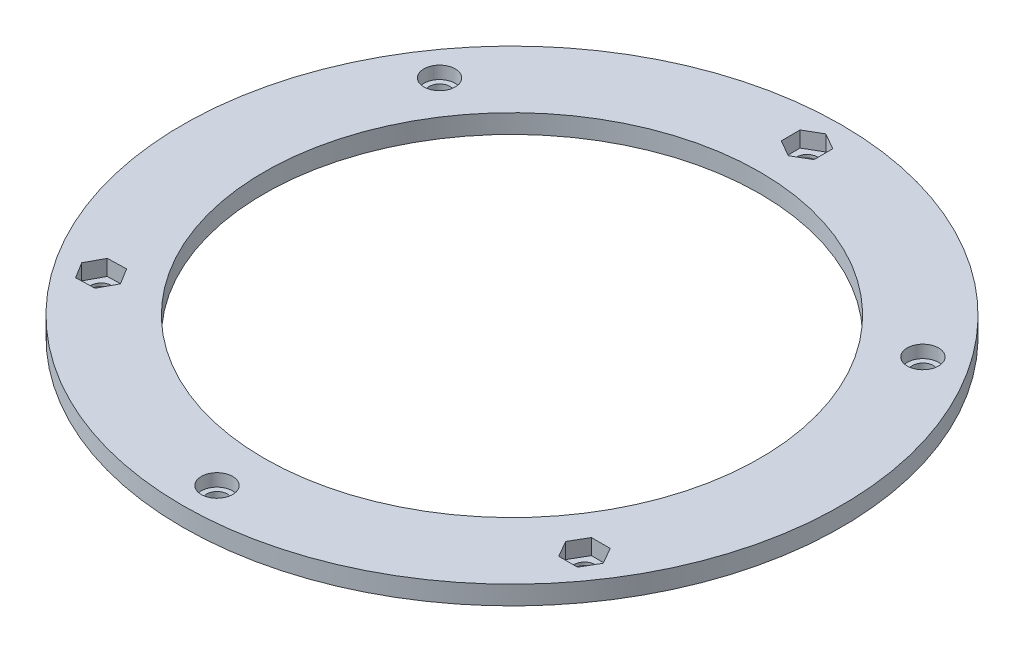
ISO-10303-21;
HEADER;
FILE_DESCRIPTION(('STEP AP214'),'2;1');
FILE_NAME('part.step','',(''),(''),'','','');
FILE_SCHEMA(('AUTOMOTIVE_DESIGN { 1 0 10303 214 1 1 1 1 }'));
ENDSEC;
DATA;
#1=APPLICATION_CONTEXT('core data for automotive mechanical design processes');
#2=APPLICATION_PROTOCOL_DEFINITION('international standard','automotive_design',2000,#1);
#3=PRODUCT_CONTEXT('',#1,'mechanical');
#4=PRODUCT('Part','Part','',(#3));
#5=PRODUCT_RELATED_PRODUCT_CATEGORY('part','',(#4));
#6=PRODUCT_DEFINITION_FORMATION('','',#4);
#7=PRODUCT_DEFINITION_CONTEXT('part definition',#1,'design');
#8=PRODUCT_DEFINITION('design','',#6,#7);
#9=PRODUCT_DEFINITION_SHAPE('','',#8);
#10=(LENGTH_UNIT() NAMED_UNIT(*) SI_UNIT(.MILLI.,.METRE.));
#11=(NAMED_UNIT(*) PLANE_ANGLE_UNIT() SI_UNIT($,.RADIAN.));
#12=(NAMED_UNIT(*) SI_UNIT($,.STERADIAN.) SOLID_ANGLE_UNIT());
#13=UNCERTAINTY_MEASURE_WITH_UNIT(LENGTH_MEASURE(1.E-05),#10,'distance_accuracy_value','');
#14=(GEOMETRIC_REPRESENTATION_CONTEXT(3) GLOBAL_UNCERTAINTY_ASSIGNED_CONTEXT((#13)) GLOBAL_UNIT_ASSIGNED_CONTEXT((#10,
#11,#12)) REPRESENTATION_CONTEXT('',''));
#15=CARTESIAN_POINT('',(0.,0.,0.));
#16=DIRECTION('',(0.,0.,1.));
#17=DIRECTION('',(1.,0.,0.));
#18=AXIS2_PLACEMENT_3D('',#15,#16,#17);
#19=CARTESIAN_POINT('',(38.5001460815826,0.,26.9580925084992));
#20=DIRECTION('',(0.,1.,0.));
#21=DIRECTION('',(0.,0.,1.));
#22=AXIS2_PLACEMENT_3D('',#19,#20,#21);
#23=CYLINDRICAL_SURFACE('',#22,1.65);
#24=CARTESIAN_POINT('',(38.5001460815826,0.,26.9580925084992));
#25=DIRECTION('',(0.,1.,0.));
#26=DIRECTION('',(0.,0.,1.));
#27=AXIS2_PLACEMENT_3D('',#24,#25,#26);
#28=CIRCLE('',#27,1.65);
#29=CARTESIAN_POINT('',(38.5001460815826,0.,28.6080925084992));
#30=VERTEX_POINT('',#29);
#31=EDGE_CURVE('E337',#30,#30,#28,.T.);
#32=ORIENTED_EDGE('',*,*,#31,.F.);
#33=EDGE_LOOP('',(#32));
#34=FACE_BOUND('',#33,.T.);
#35=CARTESIAN_POINT('',(38.5001460815826,0.5,26.9580925084992));
#36=DIRECTION('',(0.,1.,0.));
#37=DIRECTION('',(0.,0.,1.));
#38=AXIS2_PLACEMENT_3D('',#35,#36,#37);
#39=CIRCLE('',#38,1.65);
#40=CARTESIAN_POINT('',(38.5001460815826,0.5,28.6080925084992));
#41=VERTEX_POINT('',#40);
#42=EDGE_CURVE('E37',#41,#41,#39,.F.);
#43=ORIENTED_EDGE('',*,*,#42,.F.);
#44=EDGE_LOOP('',(#43));
#45=FACE_BOUND('',#44,.T.);
#46=ADVANCED_FACE('F33',(#34,#45),#23,.F.);
#47=CARTESIAN_POINT('',(-38.5001460815826,0.,26.9580925084992));
#48=DIRECTION('',(0.,1.,0.));
#49=DIRECTION('',(0.,0.,1.));
#50=AXIS2_PLACEMENT_3D('',#47,#48,#49);
#51=CYLINDRICAL_SURFACE('',#50,1.65);
#52=CARTESIAN_POINT('',(-38.5001460815826,0.,26.9580925084992));
#53=DIRECTION('',(0.,1.,0.));
#54=DIRECTION('',(0.,0.,1.));
#55=AXIS2_PLACEMENT_3D('',#52,#53,#54);
#56=CIRCLE('',#55,1.65);
#57=CARTESIAN_POINT('',(-38.5001460815826,0.,28.6080925084992));
#58=VERTEX_POINT('',#57);
#59=EDGE_CURVE('E334',#58,#58,#56,.T.);
#60=ORIENTED_EDGE('',*,*,#59,.F.);
#61=EDGE_LOOP('',(#60));
#62=FACE_BOUND('',#61,.T.);
#63=CARTESIAN_POINT('',(-38.5001460815826,0.5,26.9580925084992));
#64=DIRECTION('',(0.,1.,0.));
#65=DIRECTION('',(0.,0.,1.));
#66=AXIS2_PLACEMENT_3D('',#63,#64,#65);
#67=CIRCLE('',#66,1.65);
#68=CARTESIAN_POINT('',(-38.5001460815826,0.5,28.6080925084992));
#69=VERTEX_POINT('',#68);
#70=EDGE_CURVE('E364',#69,#69,#67,.F.);
#71=ORIENTED_EDGE('',*,*,#70,.F.);
#72=EDGE_LOOP('',(#71));
#73=FACE_BOUND('',#72,.T.);
#74=ADVANCED_FACE('F374',(#62,#73),#51,.F.);
#75=CARTESIAN_POINT('',(0.,0.,-47.));
#76=DIRECTION('',(0.,1.,0.));
#77=DIRECTION('',(0.,0.,1.));
#78=AXIS2_PLACEMENT_3D('',#75,#76,#77);
#79=CYLINDRICAL_SURFACE('',#78,1.65);
#80=CARTESIAN_POINT('',(0.,0.,-47.));
#81=DIRECTION('',(0.,1.,0.));
#82=DIRECTION('',(0.,0.,1.));
#83=AXIS2_PLACEMENT_3D('',#80,#81,#82);
#84=CIRCLE('',#83,1.65);
#85=CARTESIAN_POINT('',(0.,0.,-45.35));
#86=VERTEX_POINT('',#85);
#87=EDGE_CURVE('E329',#86,#86,#84,.T.);
#88=ORIENTED_EDGE('',*,*,#87,.F.);
#89=EDGE_LOOP('',(#88));
#90=FACE_BOUND('',#89,.T.);
#91=CARTESIAN_POINT('',(0.,0.5,-47.));
#92=DIRECTION('',(0.,1.,0.));
#93=DIRECTION('',(0.,0.,1.));
#94=AXIS2_PLACEMENT_3D('',#91,#92,#93);
#95=CIRCLE('',#94,1.65);
#96=CARTESIAN_POINT('',(0.,0.5,-45.35));
#97=VERTEX_POINT('',#96);
#98=EDGE_CURVE('E208',#97,#97,#95,.F.);
#99=ORIENTED_EDGE('',*,*,#98,.F.);
#100=EDGE_LOOP('',(#99));
#101=FACE_BOUND('',#100,.T.);
#102=ADVANCED_FACE('F380',(#90,#101),#79,.F.);
#103=CARTESIAN_POINT('',(0.,0.,47.));
#104=DIRECTION('',(0.,1.,0.));
#105=DIRECTION('',(0.,0.,1.));
#106=AXIS2_PLACEMENT_3D('',#103,#104,#105);
#107=CYLINDRICAL_SURFACE('',#106,1.65);
#108=CARTESIAN_POINT('',(0.,0.,47.));
#109=DIRECTION('',(0.,1.,0.));
#110=DIRECTION('',(0.,0.,1.));
#111=AXIS2_PLACEMENT_3D('',#108,#109,#110);
#112=CIRCLE('',#111,1.65);
#113=CARTESIAN_POINT('',(0.,0.,48.65));
#114=VERTEX_POINT('',#113);
#115=EDGE_CURVE('E333',#114,#114,#112,.T.);
#116=ORIENTED_EDGE('',*,*,#115,.F.);
#117=EDGE_LOOP('',(#116));
#118=FACE_BOUND('',#117,.T.);
#119=CARTESIAN_POINT('',(0.,1.,47.));
#120=DIRECTION('',(0.,1.,0.));
#121=DIRECTION('',(0.,0.,1.));
#122=AXIS2_PLACEMENT_3D('',#119,#120,#121);
#123=CIRCLE('',#122,1.65);
#124=CARTESIAN_POINT('',(0.,1.,48.65));
#125=VERTEX_POINT('',#124);
#126=EDGE_CURVE('E338',#125,#125,#123,.F.);
#127=ORIENTED_EDGE('',*,*,#126,.F.);
#128=EDGE_LOOP('',(#127));
#129=FACE_BOUND('',#128,.T.);
#130=ADVANCED_FACE('F420',(#118,#129),#107,.F.);
#131=CARTESIAN_POINT('',(-38.5001460815826,0.,-26.9580925084992));
#132=DIRECTION('',(0.,1.,0.));
#133=DIRECTION('',(0.,0.,1.));
#134=AXIS2_PLACEMENT_3D('',#131,#132,#133);
#135=CYLINDRICAL_SURFACE('',#134,1.65);
#136=CARTESIAN_POINT('',(-38.5001460815826,0.,-26.9580925084992));
#137=DIRECTION('',(0.,1.,0.));
#138=DIRECTION('',(0.,0.,1.));
#139=AXIS2_PLACEMENT_3D('',#136,#137,#138);
#140=CIRCLE('',#139,1.65);
#141=CARTESIAN_POINT('',(-38.5001460815826,0.,-25.3080925084992));
#142=VERTEX_POINT('',#141);
#143=EDGE_CURVE('E341',#142,#142,#140,.T.);
#144=ORIENTED_EDGE('',*,*,#143,.F.);
#145=EDGE_LOOP('',(#144));
#146=FACE_BOUND('',#145,.T.);
#147=CARTESIAN_POINT('',(-38.5001460815826,1.,-26.9580925084992));
#148=DIRECTION('',(0.,1.,0.));
#149=DIRECTION('',(0.,0.,1.));
#150=AXIS2_PLACEMENT_3D('',#147,#148,#149);
#151=CIRCLE('',#150,1.65);
#152=CARTESIAN_POINT('',(-38.5001460815826,1.,-25.3080925084992));
#153=VERTEX_POINT('',#152);
#154=EDGE_CURVE('E358',#153,#153,#151,.F.);
#155=ORIENTED_EDGE('',*,*,#154,.F.);
#156=EDGE_LOOP('',(#155));
#157=FACE_BOUND('',#156,.T.);
#158=ADVANCED_FACE('F423',(#146,#157),#135,.F.);
#159=CARTESIAN_POINT('',(38.5001460815826,0.,-26.9580925084992));
#160=DIRECTION('',(0.,1.,0.));
#161=DIRECTION('',(0.,0.,1.));
#162=AXIS2_PLACEMENT_3D('',#159,#160,#161);
#163=CYLINDRICAL_SURFACE('',#162,1.65);
#164=CARTESIAN_POINT('',(38.5001460815826,0.,-26.9580925084992));
#165=DIRECTION('',(0.,1.,0.));
#166=DIRECTION('',(0.,0.,1.));
#167=AXIS2_PLACEMENT_3D('',#164,#165,#166);
#168=CIRCLE('',#167,1.65);
#169=CARTESIAN_POINT('',(38.5001460815826,0.,-25.3080925084992));
#170=VERTEX_POINT('',#169);
#171=EDGE_CURVE('E344',#170,#170,#168,.T.);
#172=ORIENTED_EDGE('',*,*,#171,.F.);
#173=EDGE_LOOP('',(#172));
#174=FACE_BOUND('',#173,.T.);
#175=CARTESIAN_POINT('',(38.5001460815826,1.,-26.9580925084992));
#176=DIRECTION('',(0.,1.,0.));
#177=DIRECTION('',(0.,0.,1.));
#178=AXIS2_PLACEMENT_3D('',#175,#176,#177);
#179=CIRCLE('',#178,1.65);
#180=CARTESIAN_POINT('',(38.5001460815826,1.,-25.3080925084992));
#181=VERTEX_POINT('',#180);
#182=EDGE_CURVE('E313',#181,#181,#179,.F.);
#183=ORIENTED_EDGE('',*,*,#182,.F.);
#184=EDGE_LOOP('',(#183));
#185=FACE_BOUND('',#184,.T.);
#186=ADVANCED_FACE('F386',(#174,#185),#163,.F.);
#187=CARTESIAN_POINT('',(0.,3.,0.));
#188=DIRECTION('',(0.,1.,0.));
#189=DIRECTION('',(0.,0.,1.));
#190=AXIS2_PLACEMENT_3D('',#187,#188,#189);
#191=PLANE('',#190);
#192=DIRECTION('',(-0.868064953942162,0.,-0.496450637765117));
#193=VECTOR('',#192,1.);
#194=CARTESIAN_POINT('',(2.59191402300199,3.,-48.510622950099));
#195=LINE('',#194,#193);
#196=CARTESIAN_POINT('',(2.59191402300199,3.,-48.510622950099));
#197=VERTEX_POINT('',#196);
#198=CARTESIAN_POINT('',(-0.0122808388245063,3.,-49.9999748633943));
#199=VERTEX_POINT('',#198);
#200=EDGE_CURVE('E50',#197,#199,#195,.T.);
#201=ORIENTED_EDGE('',*,*,#200,.F.);
#202=DIRECTION('',(-0.00409361294150252,0.,-0.99999162113144));
#203=VECTOR('',#202,1.);
#204=CARTESIAN_POINT('',(2.60419486182649,3.,-45.5106480867046));
#205=LINE('',#204,#203);
#206=CARTESIAN_POINT('',(2.60419486182649,3.,-45.5106480867046));
#207=VERTEX_POINT('',#206);
#208=EDGE_CURVE('E182',#207,#197,#205,.T.);
#209=ORIENTED_EDGE('',*,*,#208,.F.);
#210=DIRECTION('',(0.863971341000659,0.,-0.503540983366322));
#211=VECTOR('',#210,1.);
#212=CARTESIAN_POINT('',(0.012280838824512,3.,-44.0000251366057));
#213=LINE('',#212,#211);
#214=CARTESIAN_POINT('',(0.012280838824512,3.,-44.0000251366057));
#215=VERTEX_POINT('',#214);
#216=EDGE_CURVE('E185',#215,#207,#213,.T.);
#217=ORIENTED_EDGE('',*,*,#216,.F.);
#218=DIRECTION('',(0.868064953942162,0.,0.496450637765118));
#219=VECTOR('',#218,1.);
#220=CARTESIAN_POINT('',(-2.59191402300199,3.,-45.489377049901));
#221=LINE('',#220,#219);
#222=CARTESIAN_POINT('',(-2.59191402300199,3.,-45.489377049901));
#223=VERTEX_POINT('',#222);
#224=EDGE_CURVE('E201',#223,#215,#221,.T.);
#225=ORIENTED_EDGE('',*,*,#224,.F.);
#226=DIRECTION('',(0.00409361294150238,0.,0.99999162113144));
#227=VECTOR('',#226,1.);
#228=CARTESIAN_POINT('',(-2.60419486182649,3.,-48.4893519132954));
#229=LINE('',#228,#227);
#230=CARTESIAN_POINT('',(-2.60419486182649,3.,-48.4893519132954));
#231=VERTEX_POINT('',#230);
#232=EDGE_CURVE('E198',#231,#223,#229,.T.);
#233=ORIENTED_EDGE('',*,*,#232,.F.);
#234=DIRECTION('',(-0.863971341000661,0.,0.503540983366319));
#235=VECTOR('',#234,1.);
#236=CARTESIAN_POINT('',(-0.0122808388245067,3.,-49.9999748633943));
#237=LINE('',#236,#235);
#238=EDGE_CURVE('E196',#199,#231,#237,.T.);
#239=ORIENTED_EDGE('',*,*,#238,.F.);
#240=EDGE_LOOP('',(#201,#209,#217,#225,#233,#239));
#241=FACE_BOUND('',#240,.T.);
#242=DIRECTION('',(-0.99957360189743,0.,0.0291995614658649));
#243=VECTOR('',#242,1.);
#244=CARTESIAN_POINT('',(-37.0766483647628,3.,24.3173247697139));
#245=LINE('',#244,#243);
#246=CARTESIAN_POINT('',(-37.0766483647628,3.,24.3173247697139));
#247=VERTEX_POINT('',#246);
#248=CARTESIAN_POINT('',(-40.0753691704551,3.,24.4049234541115));
#249=VERTEX_POINT('',#248);
#250=EDGE_CURVE('E58',#247,#249,#245,.T.);
#251=ORIENTED_EDGE('',*,*,#250,.F.);
#252=DIRECTION('',(-0.525074362957517,0.,-0.851056351462556));
#253=VECTOR('',#252,1.);
#254=CARTESIAN_POINT('',(-35.5014252758903,3.,26.8704938241016));
#255=LINE('',#254,#253);
#256=CARTESIAN_POINT('',(-35.5014252758903,3.,26.8704938241016));
#257=VERTEX_POINT('',#256);
#258=EDGE_CURVE('E230',#257,#247,#255,.T.);
#259=ORIENTED_EDGE('',*,*,#258,.F.);
#260=DIRECTION('',(0.47449923893991,0.,-0.88025591292842));
#261=VECTOR('',#260,1.);
#262=CARTESIAN_POINT('',(-36.92492299271,3.,29.5112615628869));
#263=LINE('',#262,#261);
#264=CARTESIAN_POINT('',(-36.92492299271,3.,29.5112615628869));
#265=VERTEX_POINT('',#264);
#266=EDGE_CURVE('E233',#265,#257,#263,.T.);
#267=ORIENTED_EDGE('',*,*,#266,.F.);
#268=DIRECTION('',(0.99957360189743,0.,-0.0291995614658581));
#269=VECTOR('',#268,1.);
#270=CARTESIAN_POINT('',(-39.9236437984023,3.,29.5988602472845));
#271=LINE('',#270,#269);
#272=CARTESIAN_POINT('',(-39.9236437984023,3.,29.5988602472845));
#273=VERTEX_POINT('',#272);
#274=EDGE_CURVE('E237',#273,#265,#271,.T.);
#275=ORIENTED_EDGE('',*,*,#274,.F.);
#276=DIRECTION('',(0.525074362957521,0.,0.851056351462553));
#277=VECTOR('',#276,1.);
#278=CARTESIAN_POINT('',(-41.4988668872749,3.,27.0456911928968));
#279=LINE('',#278,#277);
#280=CARTESIAN_POINT('',(-41.4988668872749,3.,27.0456911928968));
#281=VERTEX_POINT('',#280);
#282=EDGE_CURVE('E240',#281,#273,#279,.T.);
#283=ORIENTED_EDGE('',*,*,#282,.F.);
#284=DIRECTION('',(-0.474499238939913,0.,0.880255912928418));
#285=VECTOR('',#284,1.);
#286=CARTESIAN_POINT('',(-40.0753691704551,3.,24.4049234541115));
#287=LINE('',#286,#285);
#288=EDGE_CURVE('E243',#249,#281,#287,.T.);
#289=ORIENTED_EDGE('',*,*,#288,.F.);
#290=EDGE_LOOP('',(#251,#259,#267,#275,#283,#289));
#291=FACE_BOUND('',#290,.T.);
#292=DIRECTION('',(-0.499999999999998,0.,0.86602540378444));
#293=VECTOR('',#292,1.);
#294=CARTESIAN_POINT('',(37.0001460815826,3.,24.3600162971459));
#295=LINE('',#294,#293);
#296=CARTESIAN_POINT('',(37.0001460815826,3.,24.3600162971459));
#297=VERTEX_POINT('',#296);
#298=CARTESIAN_POINT('',(35.5001460815826,3.,26.9580925084992));
#299=VERTEX_POINT('',#298);
#300=EDGE_CURVE('E229',#297,#299,#295,.T.);
#301=ORIENTED_EDGE('',*,*,#300,.F.);
#302=DIRECTION('',(-1.,0.,0.));
#303=VECTOR('',#302,1.);
#304=CARTESIAN_POINT('',(40.0001460815826,3.,24.3600162971459));
#305=LINE('',#304,#303);
#306=CARTESIAN_POINT('',(40.0001460815826,3.,24.3600162971459));
#307=VERTEX_POINT('',#306);
#308=EDGE_CURVE('E277',#307,#297,#305,.T.);
#309=ORIENTED_EDGE('',*,*,#308,.F.);
#310=DIRECTION('',(-0.500000000000001,0.,-0.866025403784438));
#311=VECTOR('',#310,1.);
#312=CARTESIAN_POINT('',(41.5001460815826,3.,26.9580925084992));
#313=LINE('',#312,#311);
#314=CARTESIAN_POINT('',(41.5001460815826,3.,26.9580925084992));
#315=VERTEX_POINT('',#314);
#316=EDGE_CURVE('E280',#315,#307,#313,.T.);
#317=ORIENTED_EDGE('',*,*,#316,.F.);
#318=DIRECTION('',(0.500000000000001,0.,-0.866025403784438));
#319=VECTOR('',#318,1.);
#320=CARTESIAN_POINT('',(40.0001460815826,3.,29.5561687198525));
#321=LINE('',#320,#319);
#322=CARTESIAN_POINT('',(40.0001460815826,3.,29.5561687198525));
#323=VERTEX_POINT('',#322);
#324=EDGE_CURVE('E284',#323,#315,#321,.T.);
#325=ORIENTED_EDGE('',*,*,#324,.F.);
#326=DIRECTION('',(1.,0.,0.));
#327=VECTOR('',#326,1.);
#328=CARTESIAN_POINT('',(37.0001460815826,3.,29.5561687198525));
#329=LINE('',#328,#327);
#330=CARTESIAN_POINT('',(37.0001460815826,3.,29.5561687198525));
#331=VERTEX_POINT('',#330);
#332=EDGE_CURVE('E287',#331,#323,#329,.T.);
#333=ORIENTED_EDGE('',*,*,#332,.F.);
#334=DIRECTION('',(0.500000000000001,0.,0.866025403784438));
#335=VECTOR('',#334,1.);
#336=CARTESIAN_POINT('',(35.5001460815826,3.,26.9580925084992));
#337=LINE('',#336,#335);
#338=EDGE_CURVE('E290',#299,#331,#337,.T.);
#339=ORIENTED_EDGE('',*,*,#338,.F.);
#340=EDGE_LOOP('',(#301,#309,#317,#325,#333,#339));
#341=FACE_BOUND('',#340,.T.);
#342=CARTESIAN_POINT('',(-38.5001460815826,3.,-26.9580925084992));
#343=DIRECTION('',(0.,1.,0.));
#344=DIRECTION('',(0.,0.,1.));
#345=AXIS2_PLACEMENT_3D('',#342,#343,#344);
#346=CIRCLE('',#345,2.5);
#347=CARTESIAN_POINT('',(-38.5001460815826,3.,-24.4580925084992));
#348=VERTEX_POINT('',#347);
#349=EDGE_CURVE('E314',#348,#348,#346,.T.);
#350=ORIENTED_EDGE('',*,*,#349,.F.);
#351=EDGE_LOOP('',(#350));
#352=FACE_BOUND('',#351,.T.);
#353=CARTESIAN_POINT('',(38.5001460815826,3.,-26.9580925084992));
#354=DIRECTION('',(0.,1.,0.));
#355=DIRECTION('',(0.,0.,1.));
#356=AXIS2_PLACEMENT_3D('',#353,#354,#355);
#357=CIRCLE('',#356,2.5);
#358=CARTESIAN_POINT('',(38.5001460815826,3.,-24.4580925084992));
#359=VERTEX_POINT('',#358);
#360=EDGE_CURVE('E320',#359,#359,#357,.T.);
#361=ORIENTED_EDGE('',*,*,#360,.F.);
#362=EDGE_LOOP('',(#361));
#363=FACE_BOUND('',#362,.T.);
#364=CARTESIAN_POINT('',(0.,3.,47.));
#365=DIRECTION('',(0.,1.,0.));
#366=DIRECTION('',(0.,0.,1.));
#367=AXIS2_PLACEMENT_3D('',#364,#365,#366);
#368=CIRCLE('',#367,2.5);
#369=CARTESIAN_POINT('',(0.,3.,49.5));
#370=VERTEX_POINT('',#369);
#371=EDGE_CURVE('E326',#370,#370,#368,.T.);
#372=ORIENTED_EDGE('',*,*,#371,.F.);
#373=EDGE_LOOP('',(#372));
#374=FACE_BOUND('',#373,.T.);
#375=CARTESIAN_POINT('',(0.,3.,0.));
#376=DIRECTION('',(0.,1.,0.));
#377=DIRECTION('',(0.,0.,1.));
#378=AXIS2_PLACEMENT_3D('',#375,#376,#377);
#379=CIRCLE('',#378,52.5);
#380=CARTESIAN_POINT('',(0.,3.,52.5));
#381=VERTEX_POINT('',#380);
#382=EDGE_CURVE('E11',#381,#381,#379,.T.);
#383=ORIENTED_EDGE('',*,*,#382,.T.);
#384=EDGE_LOOP('',(#383));
#385=FACE_BOUND('',#384,.T.);
#386=CARTESIAN_POINT('',(0.,3.,0.));
#387=DIRECTION('',(0.,1.,0.));
#388=DIRECTION('',(0.,0.,1.));
#389=AXIS2_PLACEMENT_3D('',#386,#387,#388);
#390=CIRCLE('',#389,39.5);
#391=CARTESIAN_POINT('',(0.,3.,39.5));
#392=VERTEX_POINT('',#391);
#393=EDGE_CURVE('E349',#392,#392,#390,.T.);
#394=ORIENTED_EDGE('',*,*,#393,.F.);
#395=EDGE_LOOP('',(#394));
#396=FACE_BOUND('',#395,.T.);
#397=ADVANCED_FACE('F393',(#241,#291,#341,#352,#363,#374,#385,#396),#191,.T.);
#398=CARTESIAN_POINT('',(0.,0.,0.));
#399=DIRECTION('',(0.,1.,0.));
#400=DIRECTION('',(0.,0.,1.));
#401=AXIS2_PLACEMENT_3D('',#398,#399,#400);
#402=PLANE('',#401);
#403=ORIENTED_EDGE('',*,*,#87,.T.);
#404=EDGE_LOOP('',(#403));
#405=FACE_BOUND('',#404,.T.);
#406=ORIENTED_EDGE('',*,*,#59,.T.);
#407=EDGE_LOOP('',(#406));
#408=FACE_BOUND('',#407,.T.);
#409=ORIENTED_EDGE('',*,*,#31,.T.);
#410=EDGE_LOOP('',(#409));
#411=FACE_BOUND('',#410,.T.);
#412=ORIENTED_EDGE('',*,*,#171,.T.);
#413=EDGE_LOOP('',(#412));
#414=FACE_BOUND('',#413,.T.);
#415=ORIENTED_EDGE('',*,*,#143,.T.);
#416=EDGE_LOOP('',(#415));
#417=FACE_BOUND('',#416,.T.);
#418=ORIENTED_EDGE('',*,*,#115,.T.);
#419=EDGE_LOOP('',(#418));
#420=FACE_BOUND('',#419,.T.);
#421=CARTESIAN_POINT('',(0.,0.,0.));
#422=DIRECTION('',(0.,1.,0.));
#423=DIRECTION('',(0.,0.,1.));
#424=AXIS2_PLACEMENT_3D('',#421,#422,#423);
#425=CIRCLE('',#424,52.5);
#426=CARTESIAN_POINT('',(0.,0.,52.5));
#427=VERTEX_POINT('',#426);
#428=EDGE_CURVE('E42',#427,#427,#425,.T.);
#429=ORIENTED_EDGE('',*,*,#428,.F.);
#430=EDGE_LOOP('',(#429));
#431=FACE_BOUND('',#430,.T.);
#432=CARTESIAN_POINT('',(0.,0.,0.));
#433=DIRECTION('',(0.,1.,0.));
#434=DIRECTION('',(0.,0.,1.));
#435=AXIS2_PLACEMENT_3D('',#432,#433,#434);
#436=CIRCLE('',#435,39.5);
#437=CARTESIAN_POINT('',(0.,0.,39.5));
#438=VERTEX_POINT('',#437);
#439=EDGE_CURVE('E332',#438,#438,#436,.T.);
#440=ORIENTED_EDGE('',*,*,#439,.T.);
#441=EDGE_LOOP('',(#440));
#442=FACE_BOUND('',#441,.T.);
#443=ADVANCED_FACE('F395',(#405,#408,#411,#414,#417,#420,#431,#442),#402,.F.);
#444=CARTESIAN_POINT('',(0.,3.,0.));
#445=DIRECTION('',(0.,-1.,0.));
#446=DIRECTION('',(0.,0.,-1.));
#447=AXIS2_PLACEMENT_3D('',#444,#445,#446);
#448=CYLINDRICAL_SURFACE('',#447,52.5);
#449=ORIENTED_EDGE('',*,*,#382,.F.);
#450=EDGE_LOOP('',(#449));
#451=FACE_BOUND('',#450,.T.);
#452=ORIENTED_EDGE('',*,*,#428,.T.);
#453=EDGE_LOOP('',(#452));
#454=FACE_BOUND('',#453,.T.);
#455=ADVANCED_FACE('F35',(#451,#454),#448,.T.);
#456=CARTESIAN_POINT('',(0.,3.,0.));
#457=DIRECTION('',(0.,-1.,0.));
#458=DIRECTION('',(0.,0.,-1.));
#459=AXIS2_PLACEMENT_3D('',#456,#457,#458);
#460=CYLINDRICAL_SURFACE('',#459,39.5);
#461=ORIENTED_EDGE('',*,*,#393,.T.);
#462=EDGE_LOOP('',(#461));
#463=FACE_BOUND('',#462,.T.);
#464=ORIENTED_EDGE('',*,*,#439,.F.);
#465=EDGE_LOOP('',(#464));
#466=FACE_BOUND('',#465,.T.);
#467=ADVANCED_FACE('F388',(#463,#466),#460,.F.);
#468=CARTESIAN_POINT('',(38.5001460815826,1.,-26.9580925084992));
#469=DIRECTION('',(0.,1.,0.));
#470=DIRECTION('',(0.,0.,1.));
#471=AXIS2_PLACEMENT_3D('',#468,#469,#470);
#472=PLANE('',#471);
#473=CARTESIAN_POINT('',(38.5001460815826,1.,-26.9580925084992));
#474=DIRECTION('',(0.,1.,0.));
#475=DIRECTION('',(0.,0.,1.));
#476=AXIS2_PLACEMENT_3D('',#473,#474,#475);
#477=CIRCLE('',#476,2.5);
#478=CARTESIAN_POINT('',(38.5001460815826,1.,-24.4580925084992));
#479=VERTEX_POINT('',#478);
#480=EDGE_CURVE('E317',#479,#479,#477,.T.);
#481=ORIENTED_EDGE('',*,*,#480,.T.);
#482=EDGE_LOOP('',(#481));
#483=FACE_BOUND('',#482,.T.);
#484=ORIENTED_EDGE('',*,*,#182,.T.);
#485=EDGE_LOOP('',(#484));
#486=FACE_BOUND('',#485,.T.);
#487=ADVANCED_FACE('F391',(#483,#486),#472,.T.);
#488=CARTESIAN_POINT('',(38.5001460815826,1.,-26.9580925084992));
#489=DIRECTION('',(0.,1.,0.));
#490=DIRECTION('',(0.,0.,1.));
#491=AXIS2_PLACEMENT_3D('',#488,#489,#490);
#492=CYLINDRICAL_SURFACE('',#491,2.5);
#493=ORIENTED_EDGE('',*,*,#480,.F.);
#494=EDGE_LOOP('',(#493));
#495=FACE_BOUND('',#494,.T.);
#496=ORIENTED_EDGE('',*,*,#360,.T.);
#497=EDGE_LOOP('',(#496));
#498=FACE_BOUND('',#497,.T.);
#499=ADVANCED_FACE('F443',(#495,#498),#492,.F.);
#500=CARTESIAN_POINT('',(-38.5001460815826,1.,-26.9580925084992));
#501=DIRECTION('',(0.,1.,0.));
#502=DIRECTION('',(0.,0.,1.));
#503=AXIS2_PLACEMENT_3D('',#500,#501,#502);
#504=PLANE('',#503);
#505=CARTESIAN_POINT('',(-38.5001460815826,1.,-26.9580925084992));
#506=DIRECTION('',(0.,1.,0.));
#507=DIRECTION('',(0.,0.,1.));
#508=AXIS2_PLACEMENT_3D('',#505,#506,#507);
#509=CIRCLE('',#508,2.5);
#510=CARTESIAN_POINT('',(-38.5001460815826,1.,-24.4580925084992));
#511=VERTEX_POINT('',#510);
#512=EDGE_CURVE('E310',#511,#511,#509,.T.);
#513=ORIENTED_EDGE('',*,*,#512,.T.);
#514=EDGE_LOOP('',(#513));
#515=FACE_BOUND('',#514,.T.);
#516=ORIENTED_EDGE('',*,*,#154,.T.);
#517=EDGE_LOOP('',(#516));
#518=FACE_BOUND('',#517,.T.);
#519=ADVANCED_FACE('F439',(#515,#518),#504,.T.);
#520=CARTESIAN_POINT('',(-38.5001460815826,1.,-26.9580925084992));
#521=DIRECTION('',(0.,1.,0.));
#522=DIRECTION('',(0.,0.,1.));
#523=AXIS2_PLACEMENT_3D('',#520,#521,#522);
#524=CYLINDRICAL_SURFACE('',#523,2.5);
#525=ORIENTED_EDGE('',*,*,#512,.F.);
#526=EDGE_LOOP('',(#525));
#527=FACE_BOUND('',#526,.T.);
#528=ORIENTED_EDGE('',*,*,#349,.T.);
#529=EDGE_LOOP('',(#528));
#530=FACE_BOUND('',#529,.T.);
#531=ADVANCED_FACE('F430',(#527,#530),#524,.F.);
#532=CARTESIAN_POINT('',(0.,1.,47.));
#533=DIRECTION('',(0.,1.,0.));
#534=DIRECTION('',(0.,0.,1.));
#535=AXIS2_PLACEMENT_3D('',#532,#533,#534);
#536=PLANE('',#535);
#537=CARTESIAN_POINT('',(0.,1.,47.));
#538=DIRECTION('',(0.,1.,0.));
#539=DIRECTION('',(0.,0.,1.));
#540=AXIS2_PLACEMENT_3D('',#537,#538,#539);
#541=CIRCLE('',#540,2.5);
#542=CARTESIAN_POINT('',(0.,1.,49.5));
#543=VERTEX_POINT('',#542);
#544=EDGE_CURVE('E323',#543,#543,#541,.T.);
#545=ORIENTED_EDGE('',*,*,#544,.T.);
#546=EDGE_LOOP('',(#545));
#547=FACE_BOUND('',#546,.T.);
#548=ORIENTED_EDGE('',*,*,#126,.T.);
#549=EDGE_LOOP('',(#548));
#550=FACE_BOUND('',#549,.T.);
#551=ADVANCED_FACE('F427',(#547,#550),#536,.T.);
#552=CARTESIAN_POINT('',(0.,1.,47.));
#553=DIRECTION('',(0.,1.,0.));
#554=DIRECTION('',(0.,0.,1.));
#555=AXIS2_PLACEMENT_3D('',#552,#553,#554);
#556=CYLINDRICAL_SURFACE('',#555,2.5);
#557=ORIENTED_EDGE('',*,*,#544,.F.);
#558=EDGE_LOOP('',(#557));
#559=FACE_BOUND('',#558,.T.);
#560=ORIENTED_EDGE('',*,*,#371,.T.);
#561=EDGE_LOOP('',(#560));
#562=FACE_BOUND('',#561,.T.);
#563=ADVANCED_FACE('F429',(#559,#562),#556,.F.);
#564=CARTESIAN_POINT('',(0.,0.5,0.));
#565=DIRECTION('',(0.,1.,0.));
#566=DIRECTION('',(0.,0.,1.));
#567=AXIS2_PLACEMENT_3D('',#564,#565,#566);
#568=PLANE('',#567);
#569=DIRECTION('',(-0.868064953942162,0.,-0.496450637765117));
#570=VECTOR('',#569,1.);
#571=CARTESIAN_POINT('',(2.59191402300199,0.5,-48.510622950099));
#572=LINE('',#571,#570);
#573=CARTESIAN_POINT('',(2.59191402300199,0.5,-48.510622950099));
#574=VERTEX_POINT('',#573);
#575=CARTESIAN_POINT('',(-0.0122808388245067,0.5,-49.9999748633943));
#576=VERTEX_POINT('',#575);
#577=EDGE_CURVE('E162',#574,#576,#572,.T.);
#578=ORIENTED_EDGE('',*,*,#577,.T.);
#579=DIRECTION('',(-0.863971341000661,0.,0.503540983366319));
#580=VECTOR('',#579,1.);
#581=CARTESIAN_POINT('',(-0.0122808388245067,0.5,-49.9999748633943));
#582=LINE('',#581,#580);
#583=CARTESIAN_POINT('',(-2.60419486182649,0.5,-48.4893519132954));
#584=VERTEX_POINT('',#583);
#585=EDGE_CURVE('E171',#576,#584,#582,.T.);
#586=ORIENTED_EDGE('',*,*,#585,.T.);
#587=DIRECTION('',(0.00409361294150238,0.,0.99999162113144));
#588=VECTOR('',#587,1.);
#589=CARTESIAN_POINT('',(-2.60419486182649,0.5,-48.4893519132954));
#590=LINE('',#589,#588);
#591=CARTESIAN_POINT('',(-2.59191402300199,0.5,-45.489377049901));
#592=VERTEX_POINT('',#591);
#593=EDGE_CURVE('E176',#584,#592,#590,.T.);
#594=ORIENTED_EDGE('',*,*,#593,.T.);
#595=DIRECTION('',(0.868064953942162,0.,0.496450637765118));
#596=VECTOR('',#595,1.);
#597=CARTESIAN_POINT('',(-2.59191402300199,0.5,-45.489377049901));
#598=LINE('',#597,#596);
#599=CARTESIAN_POINT('',(0.012280838824512,0.5,-44.0000251366057));
#600=VERTEX_POINT('',#599);
#601=EDGE_CURVE('E189',#592,#600,#598,.T.);
#602=ORIENTED_EDGE('',*,*,#601,.T.);
#603=DIRECTION('',(0.863971341000659,0.,-0.503540983366322));
#604=VECTOR('',#603,1.);
#605=CARTESIAN_POINT('',(0.012280838824512,0.5,-44.0000251366057));
#606=LINE('',#605,#604);
#607=CARTESIAN_POINT('',(2.60419486182649,0.5,-45.5106480867046));
#608=VERTEX_POINT('',#607);
#609=EDGE_CURVE('E192',#600,#608,#606,.T.);
#610=ORIENTED_EDGE('',*,*,#609,.T.);
#611=DIRECTION('',(-0.00409361294150252,0.,-0.99999162113144));
#612=VECTOR('',#611,1.);
#613=CARTESIAN_POINT('',(2.60419486182649,0.5,-45.5106480867046));
#614=LINE('',#613,#612);
#615=EDGE_CURVE('E168',#608,#574,#614,.T.);
#616=ORIENTED_EDGE('',*,*,#615,.T.);
#617=EDGE_LOOP('',(#578,#586,#594,#602,#610,#616));
#618=FACE_BOUND('',#617,.T.);
#619=ORIENTED_EDGE('',*,*,#98,.T.);
#620=EDGE_LOOP('',(#619));
#621=FACE_BOUND('',#620,.T.);
#622=ADVANCED_FACE('F178',(#618,#621),#568,.T.);
#623=CARTESIAN_POINT('',(2.59191402300199,0.5,-48.510622950099));
#624=DIRECTION('',(0.496450637765117,0.,-0.868064953942162));
#625=DIRECTION('',(-0.868064953942162,0.,-0.496450637765117));
#626=AXIS2_PLACEMENT_3D('',#623,#624,#625);
#627=PLANE('',#626);
#628=ORIENTED_EDGE('',*,*,#200,.T.);
#629=DIRECTION('',(0.,1.,0.));
#630=VECTOR('',#629,1.);
#631=CARTESIAN_POINT('',(-0.0122808388245067,0.5,-49.9999748633943));
#632=LINE('',#631,#630);
#633=EDGE_CURVE('E158',#576,#199,#632,.T.);
#634=ORIENTED_EDGE('',*,*,#633,.F.);
#635=ORIENTED_EDGE('',*,*,#577,.F.);
#636=DIRECTION('',(0.,1.,0.));
#637=VECTOR('',#636,1.);
#638=CARTESIAN_POINT('',(2.59191402300199,0.5,-48.510622950099));
#639=LINE('',#638,#637);
#640=EDGE_CURVE('E206',#574,#197,#639,.T.);
#641=ORIENTED_EDGE('',*,*,#640,.T.);
#642=EDGE_LOOP('',(#628,#634,#635,#641));
#643=FACE_BOUND('',#642,.T.);
#644=ADVANCED_FACE('F160',(#643),#627,.F.);
#645=CARTESIAN_POINT('',(2.60419486182649,0.5,-45.5106480867046));
#646=DIRECTION('',(0.99999162113144,0.,-0.00409361294150252));
#647=DIRECTION('',(-0.00409361294150252,0.,-0.99999162113144));
#648=AXIS2_PLACEMENT_3D('',#645,#646,#647);
#649=PLANE('',#648);
#650=ORIENTED_EDGE('',*,*,#208,.T.);
#651=ORIENTED_EDGE('',*,*,#640,.F.);
#652=ORIENTED_EDGE('',*,*,#615,.F.);
#653=DIRECTION('',(0.,1.,0.));
#654=VECTOR('',#653,1.);
#655=CARTESIAN_POINT('',(2.60419486182649,0.5,-45.5106480867046));
#656=LINE('',#655,#654);
#657=EDGE_CURVE('E209',#608,#207,#656,.T.);
#658=ORIENTED_EDGE('',*,*,#657,.T.);
#659=EDGE_LOOP('',(#650,#651,#652,#658));
#660=FACE_BOUND('',#659,.T.);
#661=ADVANCED_FACE('F551',(#660),#649,.F.);
#662=CARTESIAN_POINT('',(0.012280838824512,0.5,-44.0000251366057));
#663=DIRECTION('',(0.503540983366322,0.,0.863971341000659));
#664=DIRECTION('',(0.863971341000659,0.,-0.503540983366322));
#665=AXIS2_PLACEMENT_3D('',#662,#663,#664);
#666=PLANE('',#665);
#667=ORIENTED_EDGE('',*,*,#216,.T.);
#668=ORIENTED_EDGE('',*,*,#657,.F.);
#669=ORIENTED_EDGE('',*,*,#609,.F.);
#670=DIRECTION('',(0.,1.,0.));
#671=VECTOR('',#670,1.);
#672=CARTESIAN_POINT('',(0.012280838824512,0.5,-44.0000251366057));
#673=LINE('',#672,#671);
#674=EDGE_CURVE('E211',#600,#215,#673,.T.);
#675=ORIENTED_EDGE('',*,*,#674,.T.);
#676=EDGE_LOOP('',(#667,#668,#669,#675));
#677=FACE_BOUND('',#676,.T.);
#678=ADVANCED_FACE('F560',(#677),#666,.F.);
#679=CARTESIAN_POINT('',(-2.59191402300199,0.5,-45.489377049901));
#680=DIRECTION('',(-0.496450637765118,0.,0.868064953942162));
#681=DIRECTION('',(0.868064953942162,0.,0.496450637765118));
#682=AXIS2_PLACEMENT_3D('',#679,#680,#681);
#683=PLANE('',#682);
#684=ORIENTED_EDGE('',*,*,#224,.T.);
#685=ORIENTED_EDGE('',*,*,#674,.F.);
#686=ORIENTED_EDGE('',*,*,#601,.F.);
#687=DIRECTION('',(0.,1.,0.));
#688=VECTOR('',#687,1.);
#689=CARTESIAN_POINT('',(-2.59191402300199,0.5,-45.489377049901));
#690=LINE('',#689,#688);
#691=EDGE_CURVE('E213',#592,#223,#690,.T.);
#692=ORIENTED_EDGE('',*,*,#691,.T.);
#693=EDGE_LOOP('',(#684,#685,#686,#692));
#694=FACE_BOUND('',#693,.T.);
#695=ADVANCED_FACE('F570',(#694),#683,.F.);
#696=CARTESIAN_POINT('',(-2.60419486182649,0.5,-48.4893519132954));
#697=DIRECTION('',(-0.99999162113144,0.,0.00409361294150238));
#698=DIRECTION('',(0.00409361294150238,0.,0.99999162113144));
#699=AXIS2_PLACEMENT_3D('',#696,#697,#698);
#700=PLANE('',#699);
#701=ORIENTED_EDGE('',*,*,#232,.T.);
#702=ORIENTED_EDGE('',*,*,#691,.F.);
#703=ORIENTED_EDGE('',*,*,#593,.F.);
#704=DIRECTION('',(0.,1.,0.));
#705=VECTOR('',#704,1.);
#706=CARTESIAN_POINT('',(-2.60419486182649,0.5,-48.4893519132954));
#707=LINE('',#706,#705);
#708=EDGE_CURVE('E167',#584,#231,#707,.T.);
#709=ORIENTED_EDGE('',*,*,#708,.T.);
#710=EDGE_LOOP('',(#701,#702,#703,#709));
#711=FACE_BOUND('',#710,.T.);
#712=ADVANCED_FACE('F580',(#711),#700,.F.);
#713=CARTESIAN_POINT('',(-0.0122808388245067,0.5,-49.9999748633943));
#714=DIRECTION('',(-0.503540983366319,0.,-0.863971341000661));
#715=DIRECTION('',(-0.863971341000661,0.,0.503540983366319));
#716=AXIS2_PLACEMENT_3D('',#713,#714,#715);
#717=PLANE('',#716);
#718=ORIENTED_EDGE('',*,*,#238,.T.);
#719=ORIENTED_EDGE('',*,*,#708,.F.);
#720=ORIENTED_EDGE('',*,*,#585,.F.);
#721=ORIENTED_EDGE('',*,*,#633,.T.);
#722=EDGE_LOOP('',(#718,#719,#720,#721));
#723=FACE_BOUND('',#722,.T.);
#724=ADVANCED_FACE('F172',(#723),#717,.F.);
#725=CARTESIAN_POINT('',(0.,0.5,0.));
#726=DIRECTION('',(0.,1.,0.));
#727=DIRECTION('',(0.,0.,1.));
#728=AXIS2_PLACEMENT_3D('',#725,#726,#727);
#729=PLANE('',#728);
#730=DIRECTION('',(-0.99957360189743,0.,0.0291995614658649));
#731=VECTOR('',#730,1.);
#732=CARTESIAN_POINT('',(-37.0766483647628,0.5,24.3173247697139));
#733=LINE('',#732,#731);
#734=CARTESIAN_POINT('',(-37.0766483647628,0.5,24.3173247697139));
#735=VERTEX_POINT('',#734);
#736=CARTESIAN_POINT('',(-40.0753691704551,0.5,24.4049234541115));
#737=VERTEX_POINT('',#736);
#738=EDGE_CURVE('E234',#735,#737,#733,.T.);
#739=ORIENTED_EDGE('',*,*,#738,.T.);
#740=DIRECTION('',(-0.474499238939913,0.,0.880255912928418));
#741=VECTOR('',#740,1.);
#742=CARTESIAN_POINT('',(-40.0753691704551,0.5,24.4049234541115));
#743=LINE('',#742,#741);
#744=CARTESIAN_POINT('',(-41.4988668872749,0.5,27.0456911928968));
#745=VERTEX_POINT('',#744);
#746=EDGE_CURVE('E258',#737,#745,#743,.T.);
#747=ORIENTED_EDGE('',*,*,#746,.T.);
#748=DIRECTION('',(0.525074362957521,0.,0.851056351462553));
#749=VECTOR('',#748,1.);
#750=CARTESIAN_POINT('',(-41.4988668872749,0.5,27.0456911928968));
#751=LINE('',#750,#749);
#752=CARTESIAN_POINT('',(-39.9236437984023,0.5,29.5988602472845));
#753=VERTEX_POINT('',#752);
#754=EDGE_CURVE('E255',#745,#753,#751,.T.);
#755=ORIENTED_EDGE('',*,*,#754,.T.);
#756=DIRECTION('',(0.99957360189743,0.,-0.0291995614658581));
#757=VECTOR('',#756,1.);
#758=CARTESIAN_POINT('',(-39.9236437984023,0.5,29.5988602472845));
#759=LINE('',#758,#757);
#760=CARTESIAN_POINT('',(-36.92492299271,0.5,29.5112615628869));
#761=VERTEX_POINT('',#760);
#762=EDGE_CURVE('E252',#753,#761,#759,.T.);
#763=ORIENTED_EDGE('',*,*,#762,.T.);
#764=DIRECTION('',(0.47449923893991,0.,-0.88025591292842));
#765=VECTOR('',#764,1.);
#766=CARTESIAN_POINT('',(-36.92492299271,0.5,29.5112615628869));
#767=LINE('',#766,#765);
#768=CARTESIAN_POINT('',(-35.5014252758903,0.5,26.8704938241016));
#769=VERTEX_POINT('',#768);
#770=EDGE_CURVE('E249',#761,#769,#767,.T.);
#771=ORIENTED_EDGE('',*,*,#770,.T.);
#772=DIRECTION('',(-0.525074362957517,0.,-0.851056351462556));
#773=VECTOR('',#772,1.);
#774=CARTESIAN_POINT('',(-35.5014252758903,0.5,26.8704938241016));
#775=LINE('',#774,#773);
#776=EDGE_CURVE('E218',#769,#735,#775,.T.);
#777=ORIENTED_EDGE('',*,*,#776,.T.);
#778=EDGE_LOOP('',(#739,#747,#755,#763,#771,#777));
#779=FACE_BOUND('',#778,.T.);
#780=ORIENTED_EDGE('',*,*,#70,.T.);
#781=EDGE_LOOP('',(#780));
#782=FACE_BOUND('',#781,.T.);
#783=ADVANCED_FACE('F599',(#779,#782),#729,.T.);
#784=CARTESIAN_POINT('',(-37.0766483647628,0.5,24.3173247697139));
#785=DIRECTION('',(-0.0291995614658649,0.,-0.99957360189743));
#786=DIRECTION('',(-0.99957360189743,0.,0.0291995614658649));
#787=AXIS2_PLACEMENT_3D('',#784,#785,#786);
#788=PLANE('',#787);
#789=ORIENTED_EDGE('',*,*,#250,.T.);
#790=DIRECTION('',(0.,1.,0.));
#791=VECTOR('',#790,1.);
#792=CARTESIAN_POINT('',(-40.0753691704551,0.5,24.4049234541115));
#793=LINE('',#792,#791);
#794=EDGE_CURVE('E216',#737,#249,#793,.T.);
#795=ORIENTED_EDGE('',*,*,#794,.F.);
#796=ORIENTED_EDGE('',*,*,#738,.F.);
#797=DIRECTION('',(0.,1.,0.));
#798=VECTOR('',#797,1.);
#799=CARTESIAN_POINT('',(-37.0766483647628,0.5,24.3173247697139));
#800=LINE('',#799,#798);
#801=EDGE_CURVE('E227',#735,#247,#800,.T.);
#802=ORIENTED_EDGE('',*,*,#801,.T.);
#803=EDGE_LOOP('',(#789,#795,#796,#802));
#804=FACE_BOUND('',#803,.T.);
#805=ADVANCED_FACE('F608',(#804),#788,.F.);
#806=CARTESIAN_POINT('',(-35.5014252758903,0.5,26.8704938241016));
#807=DIRECTION('',(0.851056351462556,0.,-0.525074362957517));
#808=DIRECTION('',(-0.525074362957517,0.,-0.851056351462556));
#809=AXIS2_PLACEMENT_3D('',#806,#807,#808);
#810=PLANE('',#809);
#811=ORIENTED_EDGE('',*,*,#258,.T.);
#812=ORIENTED_EDGE('',*,*,#801,.F.);
#813=ORIENTED_EDGE('',*,*,#776,.F.);
#814=DIRECTION('',(0.,1.,0.));
#815=VECTOR('',#814,1.);
#816=CARTESIAN_POINT('',(-35.5014252758903,0.5,26.8704938241016));
#817=LINE('',#816,#815);
#818=EDGE_CURVE('E225',#769,#257,#817,.T.);
#819=ORIENTED_EDGE('',*,*,#818,.T.);
#820=EDGE_LOOP('',(#811,#812,#813,#819));
#821=FACE_BOUND('',#820,.T.);
#822=ADVANCED_FACE('F618',(#821),#810,.F.);
#823=CARTESIAN_POINT('',(-36.92492299271,0.5,29.5112615628869));
#824=DIRECTION('',(0.88025591292842,0.,0.47449923893991));
#825=DIRECTION('',(0.47449923893991,0.,-0.88025591292842));
#826=AXIS2_PLACEMENT_3D('',#823,#824,#825);
#827=PLANE('',#826);
#828=ORIENTED_EDGE('',*,*,#266,.T.);
#829=ORIENTED_EDGE('',*,*,#818,.F.);
#830=ORIENTED_EDGE('',*,*,#770,.F.);
#831=DIRECTION('',(0.,1.,0.));
#832=VECTOR('',#831,1.);
#833=CARTESIAN_POINT('',(-36.92492299271,0.5,29.5112615628869));
#834=LINE('',#833,#832);
#835=EDGE_CURVE('E223',#761,#265,#834,.T.);
#836=ORIENTED_EDGE('',*,*,#835,.T.);
#837=EDGE_LOOP('',(#828,#829,#830,#836));
#838=FACE_BOUND('',#837,.T.);
#839=ADVANCED_FACE('F627',(#838),#827,.F.);
#840=CARTESIAN_POINT('',(-39.9236437984023,0.5,29.5988602472845));
#841=DIRECTION('',(0.0291995614658581,0.,0.99957360189743));
#842=DIRECTION('',(0.99957360189743,0.,-0.0291995614658581));
#843=AXIS2_PLACEMENT_3D('',#840,#841,#842);
#844=PLANE('',#843);
#845=ORIENTED_EDGE('',*,*,#274,.T.);
#846=ORIENTED_EDGE('',*,*,#835,.F.);
#847=ORIENTED_EDGE('',*,*,#762,.F.);
#848=DIRECTION('',(0.,1.,0.));
#849=VECTOR('',#848,1.);
#850=CARTESIAN_POINT('',(-39.9236437984023,0.5,29.5988602472845));
#851=LINE('',#850,#849);
#852=EDGE_CURVE('E221',#753,#273,#851,.T.);
#853=ORIENTED_EDGE('',*,*,#852,.T.);
#854=EDGE_LOOP('',(#845,#846,#847,#853));
#855=FACE_BOUND('',#854,.T.);
#856=ADVANCED_FACE('F637',(#855),#844,.F.);
#857=CARTESIAN_POINT('',(-41.4988668872749,0.5,27.0456911928968));
#858=DIRECTION('',(-0.851056351462553,0.,0.525074362957521));
#859=DIRECTION('',(0.525074362957521,0.,0.851056351462553));
#860=AXIS2_PLACEMENT_3D('',#857,#858,#859);
#861=PLANE('',#860);
#862=ORIENTED_EDGE('',*,*,#282,.T.);
#863=ORIENTED_EDGE('',*,*,#852,.F.);
#864=ORIENTED_EDGE('',*,*,#754,.F.);
#865=DIRECTION('',(0.,1.,0.));
#866=VECTOR('',#865,1.);
#867=CARTESIAN_POINT('',(-41.4988668872749,0.5,27.0456911928968));
#868=LINE('',#867,#866);
#869=EDGE_CURVE('E219',#745,#281,#868,.T.);
#870=ORIENTED_EDGE('',*,*,#869,.T.);
#871=EDGE_LOOP('',(#862,#863,#864,#870));
#872=FACE_BOUND('',#871,.T.);
#873=ADVANCED_FACE('F647',(#872),#861,.F.);
#874=CARTESIAN_POINT('',(-40.0753691704551,0.5,24.4049234541115));
#875=DIRECTION('',(-0.880255912928418,0.,-0.474499238939913));
#876=DIRECTION('',(-0.474499238939913,0.,0.880255912928418));
#877=AXIS2_PLACEMENT_3D('',#874,#875,#876);
#878=PLANE('',#877);
#879=ORIENTED_EDGE('',*,*,#288,.T.);
#880=ORIENTED_EDGE('',*,*,#869,.F.);
#881=ORIENTED_EDGE('',*,*,#746,.F.);
#882=ORIENTED_EDGE('',*,*,#794,.T.);
#883=EDGE_LOOP('',(#879,#880,#881,#882));
#884=FACE_BOUND('',#883,.T.);
#885=ADVANCED_FACE('F657',(#884),#878,.F.);
#886=CARTESIAN_POINT('',(0.,0.5,0.));
#887=DIRECTION('',(0.,1.,0.));
#888=DIRECTION('',(0.,0.,1.));
#889=AXIS2_PLACEMENT_3D('',#886,#887,#888);
#890=PLANE('',#889);
#891=DIRECTION('',(-0.499999999999998,0.,0.86602540378444));
#892=VECTOR('',#891,1.);
#893=CARTESIAN_POINT('',(37.0001460815826,0.5,24.3600162971459));
#894=LINE('',#893,#892);
#895=CARTESIAN_POINT('',(37.0001460815826,0.5,24.3600162971459));
#896=VERTEX_POINT('',#895);
#897=CARTESIAN_POINT('',(35.5001460815826,0.5,26.9580925084992));
#898=VERTEX_POINT('',#897);
#899=EDGE_CURVE('E281',#896,#898,#894,.T.);
#900=ORIENTED_EDGE('',*,*,#899,.T.);
#901=DIRECTION('',(0.500000000000001,0.,0.866025403784438));
#902=VECTOR('',#901,1.);
#903=CARTESIAN_POINT('',(35.5001460815826,0.5,26.9580925084992));
#904=LINE('',#903,#902);
#905=CARTESIAN_POINT('',(37.0001460815826,0.5,29.5561687198525));
#906=VERTEX_POINT('',#905);
#907=EDGE_CURVE('E305',#898,#906,#904,.T.);
#908=ORIENTED_EDGE('',*,*,#907,.T.);
#909=DIRECTION('',(1.,0.,0.));
#910=VECTOR('',#909,1.);
#911=CARTESIAN_POINT('',(37.0001460815826,0.5,29.5561687198525));
#912=LINE('',#911,#910);
#913=CARTESIAN_POINT('',(40.0001460815826,0.5,29.5561687198525));
#914=VERTEX_POINT('',#913);
#915=EDGE_CURVE('E302',#906,#914,#912,.T.);
#916=ORIENTED_EDGE('',*,*,#915,.T.);
#917=DIRECTION('',(0.500000000000001,0.,-0.866025403784438));
#918=VECTOR('',#917,1.);
#919=CARTESIAN_POINT('',(40.0001460815826,0.5,29.5561687198525));
#920=LINE('',#919,#918);
#921=CARTESIAN_POINT('',(41.5001460815826,0.5,26.9580925084992));
#922=VERTEX_POINT('',#921);
#923=EDGE_CURVE('E299',#914,#922,#920,.T.);
#924=ORIENTED_EDGE('',*,*,#923,.T.);
#925=DIRECTION('',(-0.500000000000001,0.,-0.866025403784438));
#926=VECTOR('',#925,1.);
#927=CARTESIAN_POINT('',(41.5001460815826,0.5,26.9580925084992));
#928=LINE('',#927,#926);
#929=CARTESIAN_POINT('',(40.0001460815826,0.5,24.3600162971459));
#930=VERTEX_POINT('',#929);
#931=EDGE_CURVE('E296',#922,#930,#928,.T.);
#932=ORIENTED_EDGE('',*,*,#931,.T.);
#933=DIRECTION('',(-1.,0.,0.));
#934=VECTOR('',#933,1.);
#935=CARTESIAN_POINT('',(40.0001460815826,0.5,24.3600162971459));
#936=LINE('',#935,#934);
#937=EDGE_CURVE('E266',#930,#896,#936,.T.);
#938=ORIENTED_EDGE('',*,*,#937,.T.);
#939=EDGE_LOOP('',(#900,#908,#916,#924,#932,#938));
#940=FACE_BOUND('',#939,.T.);
#941=ORIENTED_EDGE('',*,*,#42,.T.);
#942=EDGE_LOOP('',(#941));
#943=FACE_BOUND('',#942,.T.);
#944=ADVANCED_FACE('F371',(#940,#943),#890,.T.);
#945=CARTESIAN_POINT('',(37.0001460815826,0.5,24.3600162971459));
#946=DIRECTION('',(-0.86602540378444,0.,-0.499999999999998));
#947=DIRECTION('',(-0.499999999999998,0.,0.86602540378444));
#948=AXIS2_PLACEMENT_3D('',#945,#946,#947);
#949=PLANE('',#948);
#950=ORIENTED_EDGE('',*,*,#300,.T.);
#951=DIRECTION('',(0.,1.,0.));
#952=VECTOR('',#951,1.);
#953=CARTESIAN_POINT('',(35.5001460815826,0.5,26.9580925084992));
#954=LINE('',#953,#952);
#955=EDGE_CURVE('E263',#898,#299,#954,.T.);
#956=ORIENTED_EDGE('',*,*,#955,.F.);
#957=ORIENTED_EDGE('',*,*,#899,.F.);
#958=DIRECTION('',(0.,1.,0.));
#959=VECTOR('',#958,1.);
#960=CARTESIAN_POINT('',(37.0001460815826,0.5,24.3600162971459));
#961=LINE('',#960,#959);
#962=EDGE_CURVE('E275',#896,#297,#961,.T.);
#963=ORIENTED_EDGE('',*,*,#962,.T.);
#964=EDGE_LOOP('',(#950,#956,#957,#963));
#965=FACE_BOUND('',#964,.T.);
#966=ADVANCED_FACE('F676',(#965),#949,.F.);
#967=CARTESIAN_POINT('',(40.0001460815826,0.5,24.3600162971459));
#968=DIRECTION('',(0.,0.,-1.));
#969=DIRECTION('',(-1.,0.,0.));
#970=AXIS2_PLACEMENT_3D('',#967,#968,#969);
#971=PLANE('',#970);
#972=ORIENTED_EDGE('',*,*,#308,.T.);
#973=ORIENTED_EDGE('',*,*,#962,.F.);
#974=ORIENTED_EDGE('',*,*,#937,.F.);
#975=DIRECTION('',(0.,1.,0.));
#976=VECTOR('',#975,1.);
#977=CARTESIAN_POINT('',(40.0001460815826,0.5,24.3600162971459));
#978=LINE('',#977,#976);
#979=EDGE_CURVE('E273',#930,#307,#978,.T.);
#980=ORIENTED_EDGE('',*,*,#979,.T.);
#981=EDGE_LOOP('',(#972,#973,#974,#980));
#982=FACE_BOUND('',#981,.T.);
#983=ADVANCED_FACE('F685',(#982),#971,.F.);
#984=CARTESIAN_POINT('',(41.5001460815826,0.5,26.9580925084992));
#985=DIRECTION('',(0.866025403784438,0.,-0.500000000000001));
#986=DIRECTION('',(-0.500000000000001,0.,-0.866025403784438));
#987=AXIS2_PLACEMENT_3D('',#984,#985,#986);
#988=PLANE('',#987);
#989=ORIENTED_EDGE('',*,*,#316,.T.);
#990=ORIENTED_EDGE('',*,*,#979,.F.);
#991=ORIENTED_EDGE('',*,*,#931,.F.);
#992=DIRECTION('',(0.,1.,0.));
#993=VECTOR('',#992,1.);
#994=CARTESIAN_POINT('',(41.5001460815826,0.5,26.9580925084992));
#995=LINE('',#994,#993);
#996=EDGE_CURVE('E271',#922,#315,#995,.T.);
#997=ORIENTED_EDGE('',*,*,#996,.T.);
#998=EDGE_LOOP('',(#989,#990,#991,#997));
#999=FACE_BOUND('',#998,.T.);
#1000=ADVANCED_FACE('F695',(#999),#988,.F.);
#1001=CARTESIAN_POINT('',(40.0001460815826,0.5,29.5561687198525));
#1002=DIRECTION('',(0.866025403784438,0.,0.500000000000001));
#1003=DIRECTION('',(0.500000000000001,0.,-0.866025403784438));
#1004=AXIS2_PLACEMENT_3D('',#1001,#1002,#1003);
#1005=PLANE('',#1004);
#1006=ORIENTED_EDGE('',*,*,#324,.T.);
#1007=ORIENTED_EDGE('',*,*,#996,.F.);
#1008=ORIENTED_EDGE('',*,*,#923,.F.);
#1009=DIRECTION('',(0.,1.,0.));
#1010=VECTOR('',#1009,1.);
#1011=CARTESIAN_POINT('',(40.0001460815826,0.5,29.5561687198525));
#1012=LINE('',#1011,#1010);
#1013=EDGE_CURVE('E269',#914,#323,#1012,.T.);
#1014=ORIENTED_EDGE('',*,*,#1013,.T.);
#1015=EDGE_LOOP('',(#1006,#1007,#1008,#1014));
#1016=FACE_BOUND('',#1015,.T.);
#1017=ADVANCED_FACE('F704',(#1016),#1005,.F.);
#1018=CARTESIAN_POINT('',(37.0001460815826,0.5,29.5561687198525));
#1019=DIRECTION('',(0.,0.,1.));
#1020=DIRECTION('',(1.,0.,0.));
#1021=AXIS2_PLACEMENT_3D('',#1018,#1019,#1020);
#1022=PLANE('',#1021);
#1023=ORIENTED_EDGE('',*,*,#332,.T.);
#1024=ORIENTED_EDGE('',*,*,#1013,.F.);
#1025=ORIENTED_EDGE('',*,*,#915,.F.);
#1026=DIRECTION('',(0.,1.,0.));
#1027=VECTOR('',#1026,1.);
#1028=CARTESIAN_POINT('',(37.0001460815826,0.5,29.5561687198525));
#1029=LINE('',#1028,#1027);
#1030=EDGE_CURVE('E267',#906,#331,#1029,.T.);
#1031=ORIENTED_EDGE('',*,*,#1030,.T.);
#1032=EDGE_LOOP('',(#1023,#1024,#1025,#1031));
#1033=FACE_BOUND('',#1032,.T.);
#1034=ADVANCED_FACE('F714',(#1033),#1022,.F.);
#1035=CARTESIAN_POINT('',(35.5001460815826,0.5,26.9580925084992));
#1036=DIRECTION('',(-0.866025403784438,0.,0.500000000000001));
#1037=DIRECTION('',(0.500000000000001,0.,0.866025403784438));
#1038=AXIS2_PLACEMENT_3D('',#1035,#1036,#1037);
#1039=PLANE('',#1038);
#1040=ORIENTED_EDGE('',*,*,#338,.T.);
#1041=ORIENTED_EDGE('',*,*,#1030,.F.);
#1042=ORIENTED_EDGE('',*,*,#907,.F.);
#1043=ORIENTED_EDGE('',*,*,#955,.T.);
#1044=EDGE_LOOP('',(#1040,#1041,#1042,#1043));
#1045=FACE_BOUND('',#1044,.T.);
#1046=ADVANCED_FACE('F724',(#1045),#1039,.F.);
#1047=CLOSED_SHELL('',(#46,#74,#102,#130,#158,#186,#397,#443,#455,#467,#487,#499,#519,#531,#551,
#563,#622,#644,#661,#678,#695,#712,#724,#783,#805,#822,#839,#856,#873,#885,#944,#966,#983,#1000,
#1017,#1034,#1046));
#1048=MANIFOLD_SOLID_BREP('B2',#1047);
#1049=ADVANCED_BREP_SHAPE_REPRESENTATION('',(#18,#1048),#14);
#1050=SHAPE_DEFINITION_REPRESENTATION(#9,#1049);
ENDSEC;
END-ISO-10303-21;
